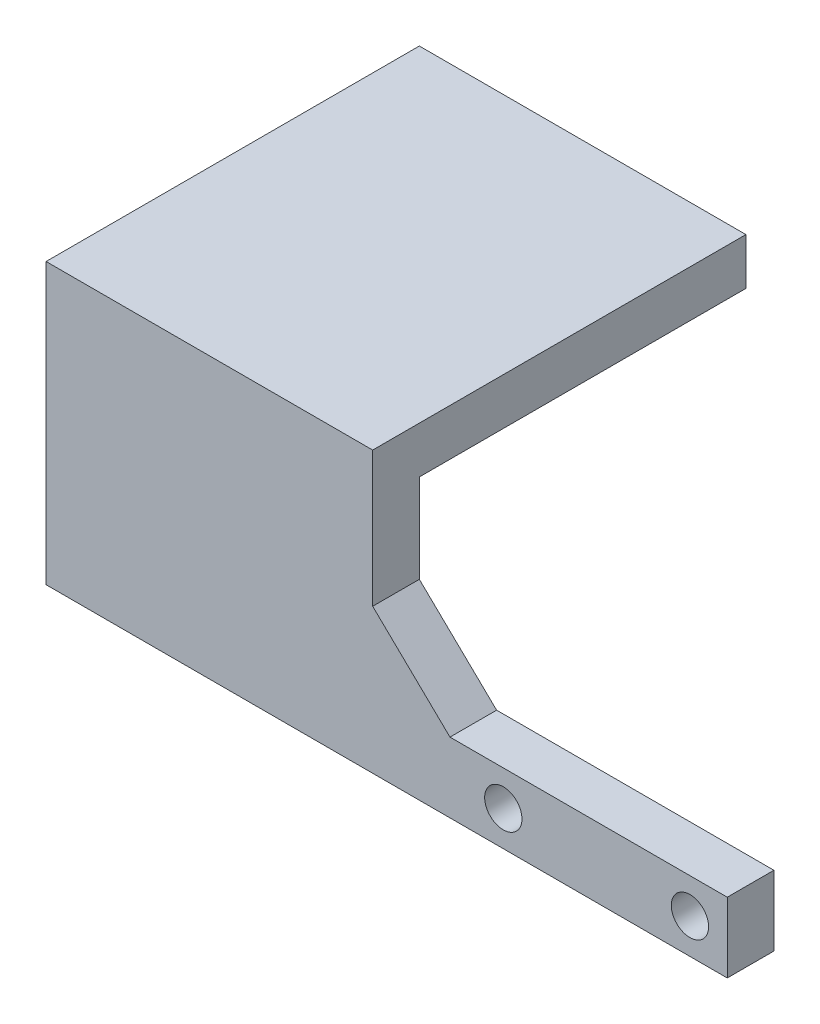
ISO-10303-21;
HEADER;
FILE_DESCRIPTION(('STEP AP214'),'2;1');
FILE_NAME('part.step','',(''),(''),'','','');
FILE_SCHEMA(('AUTOMOTIVE_DESIGN { 1 0 10303 214 1 1 1 1 }'));
ENDSEC;
DATA;
#1=APPLICATION_CONTEXT('core data for automotive mechanical design processes');
#2=APPLICATION_PROTOCOL_DEFINITION('international standard','automotive_design',2000,#1);
#3=PRODUCT_CONTEXT('',#1,'mechanical');
#4=PRODUCT('Part','Part','',(#3));
#5=PRODUCT_RELATED_PRODUCT_CATEGORY('part','',(#4));
#6=PRODUCT_DEFINITION_FORMATION('','',#4);
#7=PRODUCT_DEFINITION_CONTEXT('part definition',#1,'design');
#8=PRODUCT_DEFINITION('design','',#6,#7);
#9=PRODUCT_DEFINITION_SHAPE('','',#8);
#10=(LENGTH_UNIT() NAMED_UNIT(*) SI_UNIT(.MILLI.,.METRE.));
#11=(NAMED_UNIT(*) PLANE_ANGLE_UNIT() SI_UNIT($,.RADIAN.));
#12=(NAMED_UNIT(*) SI_UNIT($,.STERADIAN.) SOLID_ANGLE_UNIT());
#13=UNCERTAINTY_MEASURE_WITH_UNIT(LENGTH_MEASURE(1.E-05),#10,'distance_accuracy_value','');
#14=(GEOMETRIC_REPRESENTATION_CONTEXT(3) GLOBAL_UNCERTAINTY_ASSIGNED_CONTEXT((#13)) GLOBAL_UNIT_ASSIGNED_CONTEXT((#10,
#11,#12)) REPRESENTATION_CONTEXT('',''));
#15=CARTESIAN_POINT('',(0.,0.,0.));
#16=DIRECTION('',(0.,0.,1.));
#17=DIRECTION('',(1.,0.,0.));
#18=AXIS2_PLACEMENT_3D('',#15,#16,#17);
#19=CARTESIAN_POINT('',(0.,0.,5.));
#20=DIRECTION('',(0.,0.,1.));
#21=DIRECTION('',(1.,0.,0.));
#22=AXIS2_PLACEMENT_3D('',#19,#20,#21);
#23=PLANE('',#22);
#24=CARTESIAN_POINT('',(-10.,0.,5.));
#25=DIRECTION('',(0.,0.,1.));
#26=DIRECTION('',(1.,0.,0.));
#27=AXIS2_PLACEMENT_3D('',#24,#25,#26);
#28=CIRCLE('',#27,2.);
#29=CARTESIAN_POINT('',(-8.,0.,5.));
#30=VERTEX_POINT('',#29);
#31=EDGE_CURVE('E173',#30,#30,#28,.T.);
#32=ORIENTED_EDGE('',*,*,#31,.F.);
#33=EDGE_LOOP('',(#32));
#34=FACE_BOUND('',#33,.T.);
#35=DIRECTION('',(-1.,0.,0.));
#36=VECTOR('',#35,1.);
#37=CARTESIAN_POINT('',(-14.,3.75,5.));
#38=LINE('',#37,#36);
#39=CARTESIAN_POINT('',(14.,3.75,5.));
#40=VERTEX_POINT('',#39);
#41=CARTESIAN_POINT('',(-15.7157574896754,3.75,5.));
#42=VERTEX_POINT('',#41);
#43=EDGE_CURVE('E181',#40,#42,#38,.T.);
#44=ORIENTED_EDGE('',*,*,#43,.T.);
#45=DIRECTION('',(-0.719339800338655,0.694658370458994,0.));
#46=VECTOR('',#45,1.);
#47=CARTESIAN_POINT('',(-15.7157574896754,3.75,5.));
#48=LINE('',#47,#46);
#49=CARTESIAN_POINT('',(-24.,11.75,5.));
#50=VERTEX_POINT('',#49);
#51=EDGE_CURVE('E51',#42,#50,#48,.T.);
#52=ORIENTED_EDGE('',*,*,#51,.T.);
#53=DIRECTION('',(0.,1.,0.));
#54=VECTOR('',#53,1.);
#55=CARTESIAN_POINT('',(-24.,26.25,5.));
#56=LINE('',#55,#54);
#57=CARTESIAN_POINT('',(-24.,26.25,5.));
#58=VERTEX_POINT('',#57);
#59=EDGE_CURVE('E111',#50,#58,#56,.T.);
#60=ORIENTED_EDGE('',*,*,#59,.T.);
#61=DIRECTION('',(-1.,0.,0.));
#62=VECTOR('',#61,1.);
#63=CARTESIAN_POINT('',(-24.,26.25,5.));
#64=LINE('',#63,#62);
#65=CARTESIAN_POINT('',(-59.,26.25,5.));
#66=VERTEX_POINT('',#65);
#67=EDGE_CURVE('E114',#58,#66,#64,.T.);
#68=ORIENTED_EDGE('',*,*,#67,.T.);
#69=DIRECTION('',(0.,-1.,0.));
#70=VECTOR('',#69,1.);
#71=CARTESIAN_POINT('',(-59.,3.74999999999999,5.));
#72=LINE('',#71,#70);
#73=CARTESIAN_POINT('',(-59.,-3.75000000000001,5.));
#74=VERTEX_POINT('',#73);
#75=EDGE_CURVE('E184',#66,#74,#72,.T.);
#76=ORIENTED_EDGE('',*,*,#75,.T.);
#77=DIRECTION('',(1.,0.,0.));
#78=VECTOR('',#77,1.);
#79=CARTESIAN_POINT('',(-14.,-3.75,5.));
#80=LINE('',#79,#78);
#81=CARTESIAN_POINT('',(14.,-3.75,5.));
#82=VERTEX_POINT('',#81);
#83=EDGE_CURVE('E188',#74,#82,#80,.T.);
#84=ORIENTED_EDGE('',*,*,#83,.T.);
#85=DIRECTION('',(0.,1.,0.));
#86=VECTOR('',#85,1.);
#87=CARTESIAN_POINT('',(14.,3.75,5.));
#88=LINE('',#87,#86);
#89=EDGE_CURVE('E191',#82,#40,#88,.T.);
#90=ORIENTED_EDGE('',*,*,#89,.T.);
#91=EDGE_LOOP('',(#44,#52,#60,#68,#76,#84,#90));
#92=FACE_BOUND('',#91,.T.);
#93=CARTESIAN_POINT('',(10.,0.,5.));
#94=DIRECTION('',(0.,0.,1.));
#95=DIRECTION('',(1.,0.,0.));
#96=AXIS2_PLACEMENT_3D('',#93,#94,#95);
#97=CIRCLE('',#96,2.);
#98=CARTESIAN_POINT('',(12.,0.,5.));
#99=VERTEX_POINT('',#98);
#100=EDGE_CURVE('E165',#99,#99,#97,.T.);
#101=ORIENTED_EDGE('',*,*,#100,.F.);
#102=EDGE_LOOP('',(#101));
#103=FACE_BOUND('',#102,.T.);
#104=ADVANCED_FACE('F41',(#34,#92,#103),#23,.T.);
#105=CARTESIAN_POINT('',(0.,0.,0.));
#106=DIRECTION('',(0.,0.,1.));
#107=DIRECTION('',(1.,0.,0.));
#108=AXIS2_PLACEMENT_3D('',#105,#106,#107);
#109=PLANE('',#108);
#110=DIRECTION('',(0.,-1.,0.));
#111=VECTOR('',#110,1.);
#112=CARTESIAN_POINT('',(-59.,3.74999999999999,0.));
#113=LINE('',#112,#111);
#114=CARTESIAN_POINT('',(-59.,21.25,0.));
#115=VERTEX_POINT('',#114);
#116=CARTESIAN_POINT('',(-59.,-3.75000000000001,0.));
#117=VERTEX_POINT('',#116);
#118=EDGE_CURVE('E177',#115,#117,#113,.T.);
#119=ORIENTED_EDGE('',*,*,#118,.F.);
#120=DIRECTION('',(-1.,0.,0.));
#121=VECTOR('',#120,1.);
#122=CARTESIAN_POINT('',(-24.,21.25,0.));
#123=LINE('',#122,#121);
#124=CARTESIAN_POINT('',(-24.,21.25,0.));
#125=VERTEX_POINT('',#124);
#126=EDGE_CURVE('E155',#125,#115,#123,.T.);
#127=ORIENTED_EDGE('',*,*,#126,.F.);
#128=DIRECTION('',(0.,-1.,0.));
#129=VECTOR('',#128,1.);
#130=CARTESIAN_POINT('',(-24.,3.74999999999999,0.));
#131=LINE('',#130,#129);
#132=CARTESIAN_POINT('',(-24.,11.75,0.));
#133=VERTEX_POINT('',#132);
#134=EDGE_CURVE('E128',#125,#133,#131,.T.);
#135=ORIENTED_EDGE('',*,*,#134,.T.);
#136=DIRECTION('',(0.719339800338655,-0.694658370458994,0.));
#137=VECTOR('',#136,1.);
#138=CARTESIAN_POINT('',(-5.7097849308327,-5.91265538110191,0.));
#139=LINE('',#138,#137);
#140=CARTESIAN_POINT('',(-15.7157574896754,3.75,0.));
#141=VERTEX_POINT('',#140);
#142=EDGE_CURVE('E11',#133,#141,#139,.T.);
#143=ORIENTED_EDGE('',*,*,#142,.T.);
#144=DIRECTION('',(-1.,0.,0.));
#145=VECTOR('',#144,1.);
#146=CARTESIAN_POINT('',(-14.,3.75,0.));
#147=LINE('',#146,#145);
#148=CARTESIAN_POINT('',(14.,3.75,0.));
#149=VERTEX_POINT('',#148);
#150=EDGE_CURVE('E185',#149,#141,#147,.T.);
#151=ORIENTED_EDGE('',*,*,#150,.F.);
#152=DIRECTION('',(0.,1.,0.));
#153=VECTOR('',#152,1.);
#154=CARTESIAN_POINT('',(14.,3.75,0.));
#155=LINE('',#154,#153);
#156=CARTESIAN_POINT('',(14.,-3.75,0.));
#157=VERTEX_POINT('',#156);
#158=EDGE_CURVE('E202',#157,#149,#155,.T.);
#159=ORIENTED_EDGE('',*,*,#158,.F.);
#160=DIRECTION('',(1.,0.,0.));
#161=VECTOR('',#160,1.);
#162=CARTESIAN_POINT('',(-14.,-3.75,0.));
#163=LINE('',#162,#161);
#164=EDGE_CURVE('E199',#117,#157,#163,.T.);
#165=ORIENTED_EDGE('',*,*,#164,.F.);
#166=EDGE_LOOP('',(#119,#127,#135,#143,#151,#159,#165));
#167=FACE_BOUND('',#166,.T.);
#168=CARTESIAN_POINT('',(-10.,0.,0.));
#169=DIRECTION('',(0.,0.,1.));
#170=DIRECTION('',(1.,0.,0.));
#171=AXIS2_PLACEMENT_3D('',#168,#169,#170);
#172=CIRCLE('',#171,2.);
#173=CARTESIAN_POINT('',(-8.,0.,0.));
#174=VERTEX_POINT('',#173);
#175=EDGE_CURVE('E169',#174,#174,#172,.T.);
#176=ORIENTED_EDGE('',*,*,#175,.T.);
#177=EDGE_LOOP('',(#176));
#178=FACE_BOUND('',#177,.T.);
#179=CARTESIAN_POINT('',(10.,0.,0.));
#180=DIRECTION('',(0.,0.,1.));
#181=DIRECTION('',(1.,0.,0.));
#182=AXIS2_PLACEMENT_3D('',#179,#180,#181);
#183=CIRCLE('',#182,2.);
#184=CARTESIAN_POINT('',(12.,0.,0.));
#185=VERTEX_POINT('',#184);
#186=EDGE_CURVE('E159',#185,#185,#183,.T.);
#187=ORIENTED_EDGE('',*,*,#186,.T.);
#188=EDGE_LOOP('',(#187));
#189=FACE_BOUND('',#188,.T.);
#190=ADVANCED_FACE('F239',(#167,#178,#189),#109,.F.);
#191=CARTESIAN_POINT('',(-59.,3.74999999999999,5.));
#192=DIRECTION('',(1.,0.,0.));
#193=DIRECTION('',(0.,0.,-1.));
#194=AXIS2_PLACEMENT_3D('',#191,#192,#193);
#195=PLANE('',#194);
#196=ORIENTED_EDGE('',*,*,#118,.T.);
#197=DIRECTION('',(0.,0.,-1.));
#198=VECTOR('',#197,1.);
#199=CARTESIAN_POINT('',(-59.,-3.75000000000001,5.));
#200=LINE('',#199,#198);
#201=EDGE_CURVE('E215',#74,#117,#200,.T.);
#202=ORIENTED_EDGE('',*,*,#201,.F.);
#203=ORIENTED_EDGE('',*,*,#75,.F.);
#204=DIRECTION('',(0.,0.,-1.));
#205=VECTOR('',#204,1.);
#206=CARTESIAN_POINT('',(-59.,26.25,-35.));
#207=LINE('',#206,#205);
#208=CARTESIAN_POINT('',(-59.,26.25,-35.));
#209=VERTEX_POINT('',#208);
#210=EDGE_CURVE('E125',#66,#209,#207,.T.);
#211=ORIENTED_EDGE('',*,*,#210,.T.);
#212=DIRECTION('',(0.,-1.,0.));
#213=VECTOR('',#212,1.);
#214=CARTESIAN_POINT('',(-59.,21.25,-35.));
#215=LINE('',#214,#213);
#216=CARTESIAN_POINT('',(-59.,21.25,-35.));
#217=VERTEX_POINT('',#216);
#218=EDGE_CURVE('E148',#209,#217,#215,.T.);
#219=ORIENTED_EDGE('',*,*,#218,.T.);
#220=DIRECTION('',(0.,0.,1.));
#221=VECTOR('',#220,1.);
#222=CARTESIAN_POINT('',(-59.,21.25,0.));
#223=LINE('',#222,#221);
#224=EDGE_CURVE('E119',#217,#115,#223,.T.);
#225=ORIENTED_EDGE('',*,*,#224,.T.);
#226=EDGE_LOOP('',(#196,#202,#203,#211,#219,#225));
#227=FACE_BOUND('',#226,.T.);
#228=ADVANCED_FACE('F253',(#227),#195,.F.);
#229=CARTESIAN_POINT('',(-14.,-3.75,5.));
#230=DIRECTION('',(0.,1.,0.));
#231=DIRECTION('',(0.,0.,1.));
#232=AXIS2_PLACEMENT_3D('',#229,#230,#231);
#233=PLANE('',#232);
#234=ORIENTED_EDGE('',*,*,#164,.T.);
#235=DIRECTION('',(0.,0.,-1.));
#236=VECTOR('',#235,1.);
#237=CARTESIAN_POINT('',(14.,-3.75,5.));
#238=LINE('',#237,#236);
#239=EDGE_CURVE('E211',#82,#157,#238,.T.);
#240=ORIENTED_EDGE('',*,*,#239,.F.);
#241=ORIENTED_EDGE('',*,*,#83,.F.);
#242=ORIENTED_EDGE('',*,*,#201,.T.);
#243=EDGE_LOOP('',(#234,#240,#241,#242));
#244=FACE_BOUND('',#243,.T.);
#245=ADVANCED_FACE('F264',(#244),#233,.F.);
#246=CARTESIAN_POINT('',(14.,3.75,5.));
#247=DIRECTION('',(-1.,0.,0.));
#248=DIRECTION('',(0.,0.,1.));
#249=AXIS2_PLACEMENT_3D('',#246,#247,#248);
#250=PLANE('',#249);
#251=ORIENTED_EDGE('',*,*,#158,.T.);
#252=DIRECTION('',(0.,0.,-1.));
#253=VECTOR('',#252,1.);
#254=CARTESIAN_POINT('',(14.,3.75,5.));
#255=LINE('',#254,#253);
#256=EDGE_CURVE('E195',#40,#149,#255,.T.);
#257=ORIENTED_EDGE('',*,*,#256,.F.);
#258=ORIENTED_EDGE('',*,*,#89,.F.);
#259=ORIENTED_EDGE('',*,*,#239,.T.);
#260=EDGE_LOOP('',(#251,#257,#258,#259));
#261=FACE_BOUND('',#260,.T.);
#262=ADVANCED_FACE('F236',(#261),#250,.F.);
#263=CARTESIAN_POINT('',(-14.,3.75,5.));
#264=DIRECTION('',(0.,-1.,0.));
#265=DIRECTION('',(0.,0.,-1.));
#266=AXIS2_PLACEMENT_3D('',#263,#264,#265);
#267=PLANE('',#266);
#268=ORIENTED_EDGE('',*,*,#150,.T.);
#269=DIRECTION('',(0.,0.,1.));
#270=VECTOR('',#269,1.);
#271=CARTESIAN_POINT('',(-15.7157574896754,3.75,5.));
#272=LINE('',#271,#270);
#273=EDGE_CURVE('E219',#141,#42,#272,.T.);
#274=ORIENTED_EDGE('',*,*,#273,.T.);
#275=ORIENTED_EDGE('',*,*,#43,.F.);
#276=ORIENTED_EDGE('',*,*,#256,.T.);
#277=EDGE_LOOP('',(#268,#274,#275,#276));
#278=FACE_BOUND('',#277,.T.);
#279=ADVANCED_FACE('F227',(#278),#267,.F.);
#280=CARTESIAN_POINT('',(-10.,0.,5.));
#281=DIRECTION('',(0.,0.,-1.));
#282=DIRECTION('',(-1.,0.,0.));
#283=AXIS2_PLACEMENT_3D('',#280,#281,#282);
#284=CYLINDRICAL_SURFACE('',#283,2.);
#285=ORIENTED_EDGE('',*,*,#31,.T.);
#286=EDGE_LOOP('',(#285));
#287=FACE_BOUND('',#286,.T.);
#288=ORIENTED_EDGE('',*,*,#175,.F.);
#289=EDGE_LOOP('',(#288));
#290=FACE_BOUND('',#289,.T.);
#291=ADVANCED_FACE('F257',(#287,#290),#284,.F.);
#292=CARTESIAN_POINT('',(10.,0.,5.));
#293=DIRECTION('',(0.,0.,-1.));
#294=DIRECTION('',(-1.,0.,0.));
#295=AXIS2_PLACEMENT_3D('',#292,#293,#294);
#296=CYLINDRICAL_SURFACE('',#295,2.);
#297=ORIENTED_EDGE('',*,*,#100,.T.);
#298=EDGE_LOOP('',(#297));
#299=FACE_BOUND('',#298,.T.);
#300=ORIENTED_EDGE('',*,*,#186,.F.);
#301=EDGE_LOOP('',(#300));
#302=FACE_BOUND('',#301,.T.);
#303=ADVANCED_FACE('F285',(#299,#302),#296,.F.);
#304=CARTESIAN_POINT('',(-24.,21.25,0.));
#305=DIRECTION('',(0.,-1.,0.));
#306=DIRECTION('',(0.,0.,-1.));
#307=AXIS2_PLACEMENT_3D('',#304,#305,#306);
#308=PLANE('',#307);
#309=ORIENTED_EDGE('',*,*,#224,.F.);
#310=DIRECTION('',(-1.,0.,0.));
#311=VECTOR('',#310,1.);
#312=CARTESIAN_POINT('',(-24.,21.25,-35.));
#313=LINE('',#312,#311);
#314=CARTESIAN_POINT('',(-24.,21.25,-35.));
#315=VERTEX_POINT('',#314);
#316=EDGE_CURVE('E160',#315,#217,#313,.T.);
#317=ORIENTED_EDGE('',*,*,#316,.F.);
#318=DIRECTION('',(0.,0.,1.));
#319=VECTOR('',#318,1.);
#320=CARTESIAN_POINT('',(-24.,21.25,0.));
#321=LINE('',#320,#319);
#322=EDGE_CURVE('E138',#315,#125,#321,.T.);
#323=ORIENTED_EDGE('',*,*,#322,.T.);
#324=ORIENTED_EDGE('',*,*,#126,.T.);
#325=EDGE_LOOP('',(#309,#317,#323,#324));
#326=FACE_BOUND('',#325,.T.);
#327=ADVANCED_FACE('F275',(#326),#308,.T.);
#328=CARTESIAN_POINT('',(-24.,21.25,-35.));
#329=DIRECTION('',(0.,0.,-1.));
#330=DIRECTION('',(-1.,0.,0.));
#331=AXIS2_PLACEMENT_3D('',#328,#329,#330);
#332=PLANE('',#331);
#333=ORIENTED_EDGE('',*,*,#218,.F.);
#334=DIRECTION('',(-1.,0.,0.));
#335=VECTOR('',#334,1.);
#336=CARTESIAN_POINT('',(-24.,26.25,-35.));
#337=LINE('',#336,#335);
#338=CARTESIAN_POINT('',(-24.,26.25,-35.));
#339=VERTEX_POINT('',#338);
#340=EDGE_CURVE('E127',#339,#209,#337,.T.);
#341=ORIENTED_EDGE('',*,*,#340,.F.);
#342=DIRECTION('',(0.,-1.,0.));
#343=VECTOR('',#342,1.);
#344=CARTESIAN_POINT('',(-24.,21.25,-35.));
#345=LINE('',#344,#343);
#346=EDGE_CURVE('E134',#339,#315,#345,.T.);
#347=ORIENTED_EDGE('',*,*,#346,.T.);
#348=ORIENTED_EDGE('',*,*,#316,.T.);
#349=EDGE_LOOP('',(#333,#341,#347,#348));
#350=FACE_BOUND('',#349,.T.);
#351=ADVANCED_FACE('F278',(#350),#332,.T.);
#352=CARTESIAN_POINT('',(-24.,26.25,-35.));
#353=DIRECTION('',(0.,1.,0.));
#354=DIRECTION('',(0.,0.,1.));
#355=AXIS2_PLACEMENT_3D('',#352,#353,#354);
#356=PLANE('',#355);
#357=ORIENTED_EDGE('',*,*,#210,.F.);
#358=ORIENTED_EDGE('',*,*,#67,.F.);
#359=DIRECTION('',(0.,0.,-1.));
#360=VECTOR('',#359,1.);
#361=CARTESIAN_POINT('',(-24.,26.25,-35.));
#362=LINE('',#361,#360);
#363=EDGE_CURVE('E118',#58,#339,#362,.T.);
#364=ORIENTED_EDGE('',*,*,#363,.T.);
#365=ORIENTED_EDGE('',*,*,#340,.T.);
#366=EDGE_LOOP('',(#357,#358,#364,#365));
#367=FACE_BOUND('',#366,.T.);
#368=ADVANCED_FACE('F123',(#367),#356,.T.);
#369=CARTESIAN_POINT('',(-24.,0.,0.));
#370=DIRECTION('',(1.,0.,0.));
#371=DIRECTION('',(0.,0.,-1.));
#372=AXIS2_PLACEMENT_3D('',#369,#370,#371);
#373=PLANE('',#372);
#374=ORIENTED_EDGE('',*,*,#59,.F.);
#375=DIRECTION('',(0.,0.,-1.));
#376=VECTOR('',#375,1.);
#377=CARTESIAN_POINT('',(-24.,11.75,0.));
#378=LINE('',#377,#376);
#379=EDGE_CURVE('E64',#50,#133,#378,.T.);
#380=ORIENTED_EDGE('',*,*,#379,.T.);
#381=ORIENTED_EDGE('',*,*,#134,.F.);
#382=ORIENTED_EDGE('',*,*,#322,.F.);
#383=ORIENTED_EDGE('',*,*,#346,.F.);
#384=ORIENTED_EDGE('',*,*,#363,.F.);
#385=EDGE_LOOP('',(#374,#380,#381,#382,#383,#384));
#386=FACE_BOUND('',#385,.T.);
#387=ADVANCED_FACE('F131',(#386),#373,.T.);
#388=CARTESIAN_POINT('',(-15.7157574896754,3.75,5.));
#389=DIRECTION('',(-0.694658370458994,-0.719339800338655,0.));
#390=DIRECTION('',(0.,0.,1.));
#391=AXIS2_PLACEMENT_3D('',#388,#389,#390);
#392=PLANE('',#391);
#393=ORIENTED_EDGE('',*,*,#142,.F.);
#394=ORIENTED_EDGE('',*,*,#379,.F.);
#395=ORIENTED_EDGE('',*,*,#51,.F.);
#396=ORIENTED_EDGE('',*,*,#273,.F.);
#397=EDGE_LOOP('',(#393,#394,#395,#396));
#398=FACE_BOUND('',#397,.T.);
#399=ADVANCED_FACE('F44',(#398),#392,.F.);
#400=CLOSED_SHELL('',(#104,#190,#228,#245,#262,#279,#291,#303,#327,#351,#368,#387,#399));
#401=MANIFOLD_SOLID_BREP('B2',#400);
#402=ADVANCED_BREP_SHAPE_REPRESENTATION('',(#18,#401),#14);
#403=SHAPE_DEFINITION_REPRESENTATION(#9,#402);
ENDSEC;
END-ISO-10303-21;
